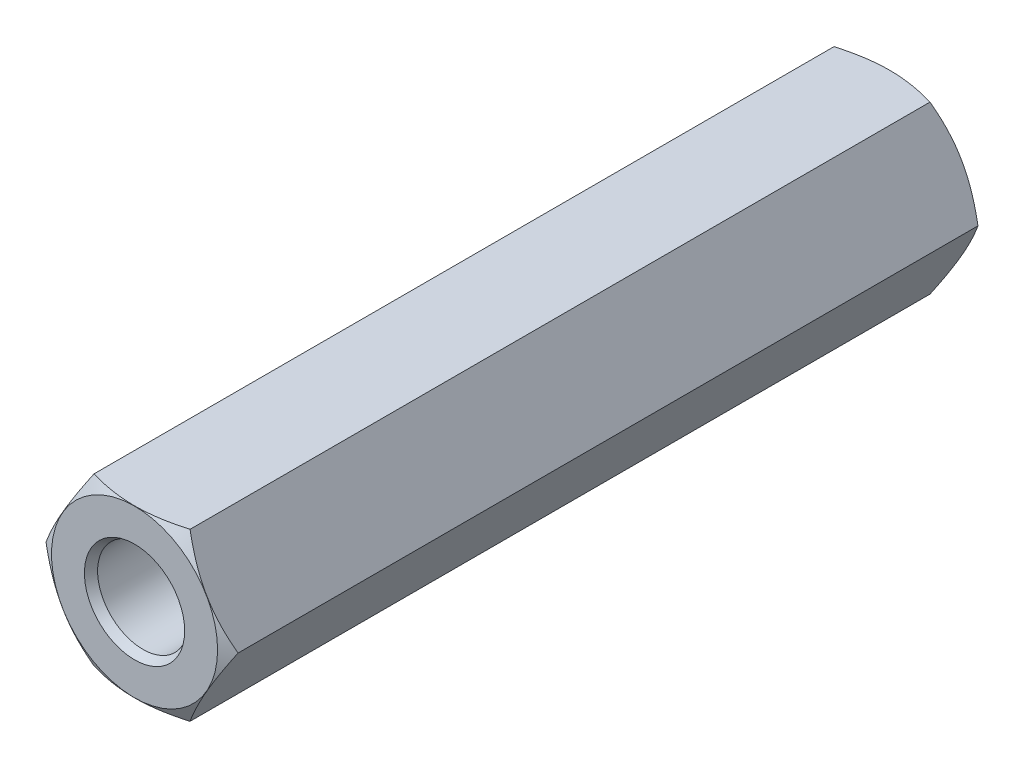
ISO-10303-21;
HEADER;
FILE_DESCRIPTION(('STEP AP214'),'2;1');
FILE_NAME('part.step','',(''),(''),'','','');
FILE_SCHEMA(('AUTOMOTIVE_DESIGN { 1 0 10303 214 1 1 1 1 }'));
ENDSEC;
DATA;
#1=APPLICATION_CONTEXT('core data for automotive mechanical design processes');
#2=APPLICATION_PROTOCOL_DEFINITION('international standard','automotive_design',2000,#1);
#3=PRODUCT_CONTEXT('',#1,'mechanical');
#4=PRODUCT('Part','Part','',(#3));
#5=PRODUCT_RELATED_PRODUCT_CATEGORY('part','',(#4));
#6=PRODUCT_DEFINITION_FORMATION('','',#4);
#7=PRODUCT_DEFINITION_CONTEXT('part definition',#1,'design');
#8=PRODUCT_DEFINITION('design','',#6,#7);
#9=PRODUCT_DEFINITION_SHAPE('','',#8);
#10=(LENGTH_UNIT() NAMED_UNIT(*) SI_UNIT(.MILLI.,.METRE.));
#11=(NAMED_UNIT(*) PLANE_ANGLE_UNIT() SI_UNIT($,.RADIAN.));
#12=(NAMED_UNIT(*) SI_UNIT($,.STERADIAN.) SOLID_ANGLE_UNIT());
#13=UNCERTAINTY_MEASURE_WITH_UNIT(LENGTH_MEASURE(1.E-05),#10,'distance_accuracy_value','');
#14=(GEOMETRIC_REPRESENTATION_CONTEXT(3) GLOBAL_UNCERTAINTY_ASSIGNED_CONTEXT((#13)) GLOBAL_UNIT_ASSIGNED_CONTEXT((#10,
#11,#12)) REPRESENTATION_CONTEXT('',''));
#15=CARTESIAN_POINT('',(0.,0.,0.));
#16=DIRECTION('',(0.,0.,1.));
#17=DIRECTION('',(1.,0.,0.));
#18=AXIS2_PLACEMENT_3D('',#15,#16,#17);
#19=CARTESIAN_POINT('',(0.,0.,15.));
#20=DIRECTION('',(0.,0.,1.));
#21=DIRECTION('',(1.,0.,0.));
#22=AXIS2_PLACEMENT_3D('',#19,#20,#21);
#23=CONICAL_SURFACE('',#22,1.5,1.047197551197);
#24=CARTESIAN_POINT('',(0.,0.,15.));
#25=DIRECTION('',(0.,0.,1.));
#26=DIRECTION('',(1.,0.,0.));
#27=AXIS2_PLACEMENT_3D('',#24,#25,#26);
#28=CIRCLE('',#27,1.5);
#29=CARTESIAN_POINT('',(1.5,0.,15.));
#30=VERTEX_POINT('',#29);
#31=EDGE_CURVE('E26',#30,#30,#28,.T.);
#32=ORIENTED_EDGE('',*,*,#31,.T.);
#33=DIRECTION('',(-0.866025403784329,0.,-0.50000000000019));
#34=VECTOR('',#33,1.);
#35=CARTESIAN_POINT('',(1.5,0.,15.));
#36=LINE('',#35,#34);
#37=CARTESIAN_POINT('',(0.,0.,14.133974596215));
#38=VERTEX_POINT('',#37);
#39=EDGE_CURVE('E10',#30,#38,#36,.T.);
#40=ORIENTED_EDGE('',*,*,#39,.T.);
#41=ORIENTED_EDGE('',*,*,#39,.F.);
#42=EDGE_LOOP('',(#32,#40,#41));
#43=FACE_BOUND('',#42,.T.);
#44=ADVANCED_FACE('F15',(#43),#23,.F.);
#45=CARTESIAN_POINT('',(0.,0.,24.72287187079));
#46=DIRECTION('',(0.,0.,-1.));
#47=DIRECTION('',(1.,0.,0.));
#48=AXIS2_PLACEMENT_3D('',#45,#46,#47);
#49=CYLINDRICAL_SURFACE('',#48,1.5);
#50=CARTESIAN_POINT('',(0.,0.,24.72287187079));
#51=DIRECTION('',(0.,0.,1.));
#52=DIRECTION('',(1.,0.,0.));
#53=AXIS2_PLACEMENT_3D('',#50,#51,#52);
#54=CIRCLE('',#53,1.5);
#55=CARTESIAN_POINT('',(1.5,0.,24.72287187079));
#56=VERTEX_POINT('',#55);
#57=EDGE_CURVE('E110',#56,#56,#54,.T.);
#58=ORIENTED_EDGE('',*,*,#57,.T.);
#59=DIRECTION('',(0.,0.,-1.));
#60=VECTOR('',#59,1.);
#61=CARTESIAN_POINT('',(1.5,0.,24.72287187079));
#62=LINE('',#61,#60);
#63=EDGE_CURVE('E103',#56,#30,#62,.T.);
#64=ORIENTED_EDGE('',*,*,#63,.T.);
#65=ORIENTED_EDGE('',*,*,#31,.F.);
#66=ORIENTED_EDGE('',*,*,#63,.F.);
#67=EDGE_LOOP('',(#58,#64,#65,#66));
#68=FACE_BOUND('',#67,.T.);
#69=ADVANCED_FACE('F289',(#68),#49,.F.);
#70=CARTESIAN_POINT('',(0.,0.,25.));
#71=DIRECTION('',(0.,0.,1.));
#72=DIRECTION('',(1.,0.,0.));
#73=AXIS2_PLACEMENT_3D('',#70,#71,#72);
#74=CONICAL_SURFACE('',#73,1.659999999999,0.523598775598);
#75=CARTESIAN_POINT('',(0.,0.,25.));
#76=DIRECTION('',(0.,0.,1.));
#77=DIRECTION('',(1.,0.,0.));
#78=AXIS2_PLACEMENT_3D('',#75,#76,#77);
#79=CIRCLE('',#78,1.659999999999);
#80=CARTESIAN_POINT('',(1.659999999999,0.,25.));
#81=VERTEX_POINT('',#80);
#82=EDGE_CURVE('E19',#81,#81,#79,.T.);
#83=ORIENTED_EDGE('',*,*,#82,.T.);
#84=DIRECTION('',(-0.499999999999757,0.,-0.866025403784579));
#85=VECTOR('',#84,1.);
#86=CARTESIAN_POINT('',(1.659999999999,0.,25.));
#87=LINE('',#86,#85);
#88=EDGE_CURVE('E111',#81,#56,#87,.T.);
#89=ORIENTED_EDGE('',*,*,#88,.T.);
#90=ORIENTED_EDGE('',*,*,#57,.F.);
#91=ORIENTED_EDGE('',*,*,#88,.F.);
#92=EDGE_LOOP('',(#83,#89,#90,#91));
#93=FACE_BOUND('',#92,.T.);
#94=ADVANCED_FACE('F294',(#93),#74,.F.);
#95=CARTESIAN_POINT('',(0.,0.,25.));
#96=DIRECTION('',(0.,0.,1.));
#97=DIRECTION('',(1.,0.,0.));
#98=AXIS2_PLACEMENT_3D('',#95,#96,#97);
#99=PLANE('',#98);
#100=ORIENTED_EDGE('',*,*,#82,.F.);
#101=EDGE_LOOP('',(#100));
#102=FACE_BOUND('',#101,.T.);
#103=CARTESIAN_POINT('',(0.,0.,25.));
#104=DIRECTION('',(0.,0.,1.));
#105=DIRECTION('',(1.,0.,0.));
#106=AXIS2_PLACEMENT_3D('',#103,#104,#105);
#107=CIRCLE('',#106,2.75);
#108=CARTESIAN_POINT('',(2.75,0.,25.));
#109=VERTEX_POINT('',#108);
#110=EDGE_CURVE('E115',#109,#109,#107,.T.);
#111=ORIENTED_EDGE('',*,*,#110,.T.);
#112=EDGE_LOOP('',(#111));
#113=FACE_BOUND('',#112,.T.);
#114=ADVANCED_FACE('F320',(#102,#113),#99,.T.);
#115=CARTESIAN_POINT('',(0.,0.,24.751739384248));
#116=DIRECTION('',(0.,0.,-1.));
#117=DIRECTION('',(1.,0.,0.));
#118=AXIS2_PLACEMENT_3D('',#115,#116,#117);
#119=CONICAL_SURFACE('',#118,3.18,1.047197551197);
#120=CARTESIAN_POINT('',(3.18000000000027,0.,24.7517393842479));
#121=CARTESIAN_POINT('',(2.38500000000004,-1.37698039201694,25.2107328482538));
#122=CARTESIAN_POINT('',(1.58999999999983,-2.75396078403385,24.751739384248));
#123=(BOUNDED_CURVE() B_SPLINE_CURVE(2,(#120,#121,#122),.UNSPECIFIED.,.F.,
.F.) B_SPLINE_CURVE_WITH_KNOTS((3,3),(0.,1.),
.UNSPECIFIED.) CURVE() GEOMETRIC_REPRESENTATION_ITEM() RATIONAL_B_SPLINE_CURVE((1.,
1.15470053837927,1.)) REPRESENTATION_ITEM(''));
#124=CARTESIAN_POINT('',(3.18,0.,24.751739384248));
#125=VERTEX_POINT('',#124);
#126=CARTESIAN_POINT('',(1.59,-2.753960784034,24.751739384248));
#127=VERTEX_POINT('',#126);
#128=EDGE_CURVE('E95',#125,#127,#123,.T.);
#129=ORIENTED_EDGE('',*,*,#128,.F.);
#130=DIRECTION('',(-0.866025403784329,0.,0.50000000000019));
#131=VECTOR('',#130,1.);
#132=CARTESIAN_POINT('',(3.18,0.,24.751739384248));
#133=LINE('',#132,#131);
#134=EDGE_CURVE('E101',#125,#109,#133,.T.);
#135=ORIENTED_EDGE('',*,*,#134,.T.);
#136=ORIENTED_EDGE('',*,*,#110,.F.);
#137=ORIENTED_EDGE('',*,*,#134,.F.);
#138=CARTESIAN_POINT('',(1.58999999999974,2.75396078403401,24.7517393842479));
#139=CARTESIAN_POINT('',(2.38499999999996,1.37698039201706,25.2107328482537));
#140=CARTESIAN_POINT('',(3.18000000000016,1.52544643583496E-13,24.751739384248));
#141=(BOUNDED_CURVE() B_SPLINE_CURVE(2,(#138,#139,#140),.UNSPECIFIED.,.F.,
.F.) B_SPLINE_CURVE_WITH_KNOTS((3,3),(0.,1.),
.UNSPECIFIED.) CURVE() GEOMETRIC_REPRESENTATION_ITEM() RATIONAL_B_SPLINE_CURVE((1.,
1.15470053837929,1.)) REPRESENTATION_ITEM(''));
#142=CARTESIAN_POINT('',(1.59,2.753960784034,24.751739384248));
#143=VERTEX_POINT('',#142);
#144=EDGE_CURVE('E94',#143,#125,#141,.T.);
#145=ORIENTED_EDGE('',*,*,#144,.F.);
#146=CARTESIAN_POINT('',(-1.58999999999976,2.753960784035,24.7517393842482));
#147=CARTESIAN_POINT('',(1.23012711128467E-13,2.753960784035,25.2107328482537));
#148=CARTESIAN_POINT('',(1.59000000000008,2.753960784035,24.751739384248));
#149=(BOUNDED_CURVE() B_SPLINE_CURVE(2,(#146,#147,#148),.UNSPECIFIED.,.F.,
.F.) B_SPLINE_CURVE_WITH_KNOTS((3,3),(0.,1.),
.UNSPECIFIED.) CURVE() GEOMETRIC_REPRESENTATION_ITEM() RATIONAL_B_SPLINE_CURVE((1.,
1.1547005383792,1.)) REPRESENTATION_ITEM(''));
#150=CARTESIAN_POINT('',(-1.59,2.753960784035,24.751739384248));
#151=VERTEX_POINT('',#150);
#152=EDGE_CURVE('E127',#151,#143,#149,.T.);
#153=ORIENTED_EDGE('',*,*,#152,.F.);
#154=CARTESIAN_POINT('',(-3.18000000000019,1.12132525487141E-13,24.7517393842479));
#155=CARTESIAN_POINT('',(-2.3849999999999,1.37698039201718,25.2107328482538));
#156=CARTESIAN_POINT('',(-1.58999999999955,2.75396078403435,24.7517393842478));
#157=(BOUNDED_CURVE() B_SPLINE_CURVE(2,(#154,#155,#156),.UNSPECIFIED.,.F.,
.F.) B_SPLINE_CURVE_WITH_KNOTS((3,3),(0.,1.),
.UNSPECIFIED.) CURVE() GEOMETRIC_REPRESENTATION_ITEM() RATIONAL_B_SPLINE_CURVE((1.,
1.15470053837932,1.)) REPRESENTATION_ITEM(''));
#158=CARTESIAN_POINT('',(-3.18,0.,24.751739384248));
#159=VERTEX_POINT('',#158);
#160=EDGE_CURVE('E134',#159,#151,#157,.T.);
#161=ORIENTED_EDGE('',*,*,#160,.F.);
#162=CARTESIAN_POINT('',(-1.58999999999887,-2.75396078403551,24.7517393842474));
#163=CARTESIAN_POINT('',(-2.38499999999965,-1.37698039201761,25.210732848254));
#164=CARTESIAN_POINT('',(-3.18000000000019,-1.09245945623115E-13,24.7517393842479));
#165=(BOUNDED_CURVE() B_SPLINE_CURVE(2,(#162,#163,#164),.UNSPECIFIED.,.F.,
.F.) B_SPLINE_CURVE_WITH_KNOTS((3,3),(0.,1.),
.UNSPECIFIED.) CURVE() GEOMETRIC_REPRESENTATION_ITEM() RATIONAL_B_SPLINE_CURVE((1.,
1.15470053837943,1.)) REPRESENTATION_ITEM(''));
#166=CARTESIAN_POINT('',(-1.59,-2.753960784035,24.751739384248));
#167=VERTEX_POINT('',#166);
#168=EDGE_CURVE('E133',#167,#159,#165,.T.);
#169=ORIENTED_EDGE('',*,*,#168,.F.);
#170=CARTESIAN_POINT('',(1.58999999999976,-2.753960784035,24.7517393842482));
#171=CARTESIAN_POINT('',(-1.21680443498917E-13,-2.753960784035,25.2107328482537));
#172=CARTESIAN_POINT('',(-1.59000000000008,-2.753960784035,24.751739384248));
#173=(BOUNDED_CURVE() B_SPLINE_CURVE(2,(#170,#171,#172),.UNSPECIFIED.,.F.,
.F.) B_SPLINE_CURVE_WITH_KNOTS((3,3),(0.,1.),
.UNSPECIFIED.) CURVE() GEOMETRIC_REPRESENTATION_ITEM() RATIONAL_B_SPLINE_CURVE((1.,
1.1547005383792,1.)) REPRESENTATION_ITEM(''));
#174=EDGE_CURVE('E102',#127,#167,#173,.T.);
#175=ORIENTED_EDGE('',*,*,#174,.F.);
#176=EDGE_LOOP('',(#129,#135,#136,#137,#145,#153,#161,#169,#175));
#177=FACE_BOUND('',#176,.T.);
#178=ADVANCED_FACE('F303',(#177),#119,.T.);
#179=CARTESIAN_POINT('',(1.59,-2.753960784035,0.));
#180=DIRECTION('',(-0.866025403784329,0.50000000000019,0.));
#181=DIRECTION('',(0.,0.,1.));
#182=AXIS2_PLACEMENT_3D('',#179,#180,#181);
#183=PLANE('',#182);
#184=DIRECTION('',(0.,0.,1.));
#185=VECTOR('',#184,1.);
#186=CARTESIAN_POINT('',(3.18,0.,0.248260615752));
#187=LINE('',#186,#185);
#188=CARTESIAN_POINT('',(3.18,0.,0.248260615752));
#189=VERTEX_POINT('',#188);
#190=EDGE_CURVE('E128',#189,#125,#187,.T.);
#191=ORIENTED_EDGE('',*,*,#190,.T.);
#192=ORIENTED_EDGE('',*,*,#128,.T.);
#193=DIRECTION('',(0.,0.,1.));
#194=VECTOR('',#193,1.);
#195=CARTESIAN_POINT('',(1.59,-2.753960784035,0.));
#196=LINE('',#195,#194);
#197=CARTESIAN_POINT('',(1.59,-2.753960784034,0.248260615752));
#198=VERTEX_POINT('',#197);
#199=EDGE_CURVE('E155',#198,#127,#196,.T.);
#200=ORIENTED_EDGE('',*,*,#199,.F.);
#201=CARTESIAN_POINT('',(1.58999999999974,-2.75396078403401,0.248260615752079));
#202=CARTESIAN_POINT('',(2.38499999999996,-1.37698039201706,-0.210732848253774));
#203=CARTESIAN_POINT('',(3.18000000000017,-1.49213974509621E-13,0.248260615752026));
#204=(BOUNDED_CURVE() B_SPLINE_CURVE(2,(#201,#202,#203),.UNSPECIFIED.,.F.,
.F.) B_SPLINE_CURVE_WITH_KNOTS((3,3),(0.,1.),
.UNSPECIFIED.) CURVE() GEOMETRIC_REPRESENTATION_ITEM() RATIONAL_B_SPLINE_CURVE((1.,
1.15470053837928,1.)) REPRESENTATION_ITEM(''));
#205=EDGE_CURVE('E76',#198,#189,#204,.T.);
#206=ORIENTED_EDGE('',*,*,#205,.T.);
#207=EDGE_LOOP('',(#191,#192,#200,#206));
#208=FACE_BOUND('',#207,.T.);
#209=ADVANCED_FACE('F300',(#208),#183,.F.);
#210=CARTESIAN_POINT('',(-1.59,-2.753960784035,0.));
#211=DIRECTION('',(0.,1.,0.));
#212=DIRECTION('',(1.,0.,0.));
#213=AXIS2_PLACEMENT_3D('',#210,#211,#212);
#214=PLANE('',#213);
#215=ORIENTED_EDGE('',*,*,#199,.T.);
#216=ORIENTED_EDGE('',*,*,#174,.T.);
#217=DIRECTION('',(0.,0.,1.));
#218=VECTOR('',#217,1.);
#219=CARTESIAN_POINT('',(-1.59,-2.753960784035,0.));
#220=LINE('',#219,#218);
#221=CARTESIAN_POINT('',(-1.59,-2.753960784035,0.248260615752));
#222=VERTEX_POINT('',#221);
#223=EDGE_CURVE('E129',#222,#167,#220,.T.);
#224=ORIENTED_EDGE('',*,*,#223,.F.);
#225=CARTESIAN_POINT('',(-1.58999999999975,-2.753960784035,0.248260615751858));
#226=CARTESIAN_POINT('',(1.22568621918617E-13,-2.75396078403501,-0.210732848253664));
#227=CARTESIAN_POINT('',(1.59000000000008,-2.753960784035,0.248260615751953));
#228=(BOUNDED_CURVE() B_SPLINE_CURVE(2,(#225,#226,#227),.UNSPECIFIED.,.F.,
.F.) B_SPLINE_CURVE_WITH_KNOTS((3,3),(0.,1.),
.UNSPECIFIED.) CURVE() GEOMETRIC_REPRESENTATION_ITEM() RATIONAL_B_SPLINE_CURVE((1.,
1.15470053837918,1.)) REPRESENTATION_ITEM(''));
#229=EDGE_CURVE('E82',#222,#198,#228,.T.);
#230=ORIENTED_EDGE('',*,*,#229,.T.);
#231=EDGE_LOOP('',(#215,#216,#224,#230));
#232=FACE_BOUND('',#231,.T.);
#233=ADVANCED_FACE('F298',(#232),#214,.F.);
#234=CARTESIAN_POINT('',(-3.18,0.,0.));
#235=DIRECTION('',(0.866025403784329,0.50000000000019,0.));
#236=DIRECTION('',(0.,0.,-1.));
#237=AXIS2_PLACEMENT_3D('',#234,#235,#236);
#238=PLANE('',#237);
#239=ORIENTED_EDGE('',*,*,#223,.T.);
#240=ORIENTED_EDGE('',*,*,#168,.T.);
#241=DIRECTION('',(0.,0.,1.));
#242=VECTOR('',#241,1.);
#243=CARTESIAN_POINT('',(-3.18,0.,0.));
#244=LINE('',#243,#242);
#245=CARTESIAN_POINT('',(-3.18,0.,0.248260615752));
#246=VERTEX_POINT('',#245);
#247=EDGE_CURVE('E190',#246,#159,#244,.T.);
#248=ORIENTED_EDGE('',*,*,#247,.F.);
#249=CARTESIAN_POINT('',(-3.18000000000019,-1.10578213252666E-13,0.248260615752039));
#250=CARTESIAN_POINT('',(-2.3849999999999,-1.37698039201718,-0.210732848253821));
#251=CARTESIAN_POINT('',(-1.58999999999955,-2.75396078403435,0.248260615752193));
#252=(BOUNDED_CURVE() B_SPLINE_CURVE(2,(#249,#250,#251),.UNSPECIFIED.,.F.,
.F.) B_SPLINE_CURVE_WITH_KNOTS((3,3),(0.,1.),
.UNSPECIFIED.) CURVE() GEOMETRIC_REPRESENTATION_ITEM() RATIONAL_B_SPLINE_CURVE((1.,
1.15470053837932,1.)) REPRESENTATION_ITEM(''));
#253=EDGE_CURVE('E182',#246,#222,#252,.T.);
#254=ORIENTED_EDGE('',*,*,#253,.T.);
#255=EDGE_LOOP('',(#239,#240,#248,#254));
#256=FACE_BOUND('',#255,.T.);
#257=ADVANCED_FACE('F314',(#256),#238,.F.);
#258=CARTESIAN_POINT('',(-1.59,2.753960784035,0.));
#259=DIRECTION('',(0.866025403784329,-0.50000000000019,0.));
#260=DIRECTION('',(0.,0.,-1.));
#261=AXIS2_PLACEMENT_3D('',#258,#259,#260);
#262=PLANE('',#261);
#263=ORIENTED_EDGE('',*,*,#247,.T.);
#264=ORIENTED_EDGE('',*,*,#160,.T.);
#265=DIRECTION('',(0.,0.,1.));
#266=VECTOR('',#265,1.);
#267=CARTESIAN_POINT('',(-1.59,2.753960784035,0.));
#268=LINE('',#267,#266);
#269=CARTESIAN_POINT('',(-1.59,2.753960784035,0.248260615752));
#270=VERTEX_POINT('',#269);
#271=EDGE_CURVE('E123',#270,#151,#268,.T.);
#272=ORIENTED_EDGE('',*,*,#271,.F.);
#273=CARTESIAN_POINT('',(-1.58999999999887,2.75396078403551,0.248260615752579));
#274=CARTESIAN_POINT('',(-2.38499999999965,1.37698039201761,-0.210732848253967));
#275=CARTESIAN_POINT('',(-3.18000000000019,1.0946799022804E-13,0.24826061575204));
#276=(BOUNDED_CURVE() B_SPLINE_CURVE(2,(#273,#274,#275),.UNSPECIFIED.,.F.,
.F.) B_SPLINE_CURVE_WITH_KNOTS((3,3),(0.,1.),
.UNSPECIFIED.) CURVE() GEOMETRIC_REPRESENTATION_ITEM() RATIONAL_B_SPLINE_CURVE((1.,
1.15470053837944,1.)) REPRESENTATION_ITEM(''));
#277=EDGE_CURVE('E145',#270,#246,#276,.T.);
#278=ORIENTED_EDGE('',*,*,#277,.T.);
#279=EDGE_LOOP('',(#263,#264,#272,#278));
#280=FACE_BOUND('',#279,.T.);
#281=ADVANCED_FACE('F309',(#280),#262,.F.);
#282=CARTESIAN_POINT('',(1.59,2.753960784035,0.));
#283=DIRECTION('',(0.,-1.,0.));
#284=DIRECTION('',(-1.,0.,0.));
#285=AXIS2_PLACEMENT_3D('',#282,#283,#284);
#286=PLANE('',#285);
#287=ORIENTED_EDGE('',*,*,#271,.T.);
#288=ORIENTED_EDGE('',*,*,#152,.T.);
#289=DIRECTION('',(0.,0.,1.));
#290=VECTOR('',#289,1.);
#291=CARTESIAN_POINT('',(1.59,2.753960784035,0.));
#292=LINE('',#291,#290);
#293=CARTESIAN_POINT('',(1.59,2.753960784034,0.248260615752));
#294=VERTEX_POINT('',#293);
#295=EDGE_CURVE('E91',#294,#143,#292,.T.);
#296=ORIENTED_EDGE('',*,*,#295,.F.);
#297=CARTESIAN_POINT('',(1.58999999999975,2.753960784035,0.248260615751858));
#298=CARTESIAN_POINT('',(-1.22124532708767E-13,2.75396078403501,-0.210732848253664));
#299=CARTESIAN_POINT('',(-1.59000000000008,2.753960784035,0.248260615751953));
#300=(BOUNDED_CURVE() B_SPLINE_CURVE(2,(#297,#298,#299),.UNSPECIFIED.,.F.,
.F.) B_SPLINE_CURVE_WITH_KNOTS((3,3),(0.,1.),
.UNSPECIFIED.) CURVE() GEOMETRIC_REPRESENTATION_ITEM() RATIONAL_B_SPLINE_CURVE((1.,
1.15470053837918,1.)) REPRESENTATION_ITEM(''));
#301=EDGE_CURVE('E140',#294,#270,#300,.T.);
#302=ORIENTED_EDGE('',*,*,#301,.T.);
#303=EDGE_LOOP('',(#287,#288,#296,#302));
#304=FACE_BOUND('',#303,.T.);
#305=ADVANCED_FACE('F305',(#304),#286,.F.);
#306=CARTESIAN_POINT('',(3.18,0.,0.));
#307=DIRECTION('',(-0.866025403784329,-0.50000000000019,0.));
#308=DIRECTION('',(-0.50000000000019,0.866025403784329,0.));
#309=AXIS2_PLACEMENT_3D('',#306,#307,#308);
#310=PLANE('',#309);
#311=ORIENTED_EDGE('',*,*,#295,.T.);
#312=ORIENTED_EDGE('',*,*,#144,.T.);
#313=ORIENTED_EDGE('',*,*,#190,.F.);
#314=CARTESIAN_POINT('',(3.18000000000026,0.,0.248260615752079));
#315=CARTESIAN_POINT('',(2.38500000000004,1.37698039201694,-0.210732848253774));
#316=CARTESIAN_POINT('',(1.58999999999983,2.75396078403385,0.248260615752026));
#317=(BOUNDED_CURVE() B_SPLINE_CURVE(2,(#314,#315,#316),.UNSPECIFIED.,.F.,
.F.) B_SPLINE_CURVE_WITH_KNOTS((3,3),(0.,1.),
.UNSPECIFIED.) CURVE() GEOMETRIC_REPRESENTATION_ITEM() RATIONAL_B_SPLINE_CURVE((1.,
1.15470053837928,1.)) REPRESENTATION_ITEM(''));
#318=EDGE_CURVE('E72',#189,#294,#317,.T.);
#319=ORIENTED_EDGE('',*,*,#318,.T.);
#320=EDGE_LOOP('',(#311,#312,#313,#319));
#321=FACE_BOUND('',#320,.T.);
#322=ADVANCED_FACE('F308',(#321),#310,.F.);
#323=CARTESIAN_POINT('',(0.,0.,0.));
#324=DIRECTION('',(0.,0.,1.));
#325=DIRECTION('',(1.,0.,0.));
#326=AXIS2_PLACEMENT_3D('',#323,#324,#325);
#327=CONICAL_SURFACE('',#326,2.75,1.047197551197);
#328=DIRECTION('',(0.866025403784329,0.,0.50000000000019));
#329=VECTOR('',#328,1.);
#330=CARTESIAN_POINT('',(2.75,0.,0.));
#331=LINE('',#330,#329);
#332=CARTESIAN_POINT('',(2.75,0.,0.));
#333=VERTEX_POINT('',#332);
#334=EDGE_CURVE('E67',#333,#189,#331,.T.);
#335=ORIENTED_EDGE('',*,*,#334,.F.);
#336=CARTESIAN_POINT('',(0.,0.,0.));
#337=DIRECTION('',(0.,0.,1.));
#338=DIRECTION('',(1.,0.,0.));
#339=AXIS2_PLACEMENT_3D('',#336,#337,#338);
#340=CIRCLE('',#339,2.75);
#341=EDGE_CURVE('E69',#333,#333,#340,.T.);
#342=ORIENTED_EDGE('',*,*,#341,.T.);
#343=ORIENTED_EDGE('',*,*,#334,.T.);
#344=ORIENTED_EDGE('',*,*,#205,.F.);
#345=ORIENTED_EDGE('',*,*,#229,.F.);
#346=ORIENTED_EDGE('',*,*,#253,.F.);
#347=ORIENTED_EDGE('',*,*,#277,.F.);
#348=ORIENTED_EDGE('',*,*,#301,.F.);
#349=ORIENTED_EDGE('',*,*,#318,.F.);
#350=EDGE_LOOP('',(#335,#342,#343,#344,#345,#346,#347,#348,#349));
#351=FACE_BOUND('',#350,.T.);
#352=ADVANCED_FACE('F17',(#351),#327,.T.);
#353=CARTESIAN_POINT('',(0.,0.,0.));
#354=DIRECTION('',(0.,0.,1.));
#355=DIRECTION('',(1.,0.,0.));
#356=AXIS2_PLACEMENT_3D('',#353,#354,#355);
#357=PLANE('',#356);
#358=ORIENTED_EDGE('',*,*,#341,.F.);
#359=EDGE_LOOP('',(#358));
#360=FACE_BOUND('',#359,.T.);
#361=CARTESIAN_POINT('',(0.,0.,0.));
#362=DIRECTION('',(0.,0.,1.));
#363=DIRECTION('',(1.,0.,0.));
#364=AXIS2_PLACEMENT_3D('',#361,#362,#363);
#365=CIRCLE('',#364,1.66);
#366=CARTESIAN_POINT('',(1.66,0.,0.));
#367=VERTEX_POINT('',#366);
#368=EDGE_CURVE('E85',#367,#367,#365,.T.);
#369=ORIENTED_EDGE('',*,*,#368,.T.);
#370=EDGE_LOOP('',(#369));
#371=FACE_BOUND('',#370,.T.);
#372=ADVANCED_FACE('F312',(#360,#371),#357,.F.);
#373=CARTESIAN_POINT('',(0.,0.,0.27712812921));
#374=DIRECTION('',(0.,0.,-1.));
#375=DIRECTION('',(1.,0.,0.));
#376=AXIS2_PLACEMENT_3D('',#373,#374,#375);
#377=CONICAL_SURFACE('',#376,1.5,0.5235987756);
#378=CARTESIAN_POINT('',(0.,0.,0.27712812921));
#379=DIRECTION('',(0.,0.,1.));
#380=DIRECTION('',(1.,0.,0.));
#381=AXIS2_PLACEMENT_3D('',#378,#379,#380);
#382=CIRCLE('',#381,1.5);
#383=CARTESIAN_POINT('',(1.5,0.,0.27712812921));
#384=VERTEX_POINT('',#383);
#385=EDGE_CURVE('E89',#384,#384,#382,.T.);
#386=ORIENTED_EDGE('',*,*,#385,.T.);
#387=DIRECTION('',(0.500000000002123,0.,-0.866025403783213));
#388=VECTOR('',#387,1.);
#389=CARTESIAN_POINT('',(1.5,0.,0.27712812921));
#390=LINE('',#389,#388);
#391=EDGE_CURVE('E119',#384,#367,#390,.T.);
#392=ORIENTED_EDGE('',*,*,#391,.T.);
#393=ORIENTED_EDGE('',*,*,#368,.F.);
#394=ORIENTED_EDGE('',*,*,#391,.F.);
#395=EDGE_LOOP('',(#386,#392,#393,#394));
#396=FACE_BOUND('',#395,.T.);
#397=ADVANCED_FACE('F285',(#396),#377,.F.);
#398=CARTESIAN_POINT('',(0.,0.,10.));
#399=DIRECTION('',(0.,0.,-1.));
#400=DIRECTION('',(1.,0.,0.));
#401=AXIS2_PLACEMENT_3D('',#398,#399,#400);
#402=CYLINDRICAL_SURFACE('',#401,1.5);
#403=CARTESIAN_POINT('',(0.,0.,10.));
#404=DIRECTION('',(0.,0.,1.));
#405=DIRECTION('',(1.,0.,0.));
#406=AXIS2_PLACEMENT_3D('',#403,#404,#405);
#407=CIRCLE('',#406,1.5);
#408=CARTESIAN_POINT('',(1.5,0.,10.));
#409=VERTEX_POINT('',#408);
#410=EDGE_CURVE('E139',#409,#409,#407,.T.);
#411=ORIENTED_EDGE('',*,*,#410,.T.);
#412=DIRECTION('',(0.,0.,-1.));
#413=VECTOR('',#412,1.);
#414=CARTESIAN_POINT('',(1.5,0.,10.));
#415=LINE('',#414,#413);
#416=EDGE_CURVE('E164',#409,#384,#415,.T.);
#417=ORIENTED_EDGE('',*,*,#416,.T.);
#418=ORIENTED_EDGE('',*,*,#385,.F.);
#419=ORIENTED_EDGE('',*,*,#416,.F.);
#420=EDGE_LOOP('',(#411,#417,#418,#419));
#421=FACE_BOUND('',#420,.T.);
#422=ADVANCED_FACE('F273',(#421),#402,.F.);
#423=CARTESIAN_POINT('',(0.,0.,9.866025403784));
#424=DIRECTION('',(0.,0.,-1.));
#425=DIRECTION('',(1.,0.,0.));
#426=AXIS2_PLACEMENT_3D('',#423,#424,#425);
#427=CONICAL_SURFACE('',#426,1.73205080757049,1.047197551197);
#428=DIRECTION('',(0.866025403784329,0.,-0.50000000000019));
#429=VECTOR('',#428,1.);
#430=CARTESIAN_POINT('',(0.,0.,10.866025403784));
#431=LINE('',#430,#429);
#432=CARTESIAN_POINT('',(0.,0.,10.866025403784));
#433=VERTEX_POINT('',#432);
#434=EDGE_CURVE('E135',#433,#409,#431,.T.);
#435=ORIENTED_EDGE('',*,*,#434,.T.);
#436=ORIENTED_EDGE('',*,*,#410,.F.);
#437=ORIENTED_EDGE('',*,*,#434,.F.);
#438=EDGE_LOOP('',(#435,#436,#437));
#439=FACE_BOUND('',#438,.T.);
#440=ADVANCED_FACE('F278',(#439),#427,.F.);
#441=CLOSED_SHELL('',(#44,#69,#94,#114,#178,#209,#233,#257,#281,#305,#322,#352,#372,#397,#422,#440));
#442=MANIFOLD_SOLID_BREP('B1',#441);
#443=ADVANCED_BREP_SHAPE_REPRESENTATION('',(#18,#442),#14);
#444=SHAPE_DEFINITION_REPRESENTATION(#9,#443);
ENDSEC;
END-ISO-10303-21;
